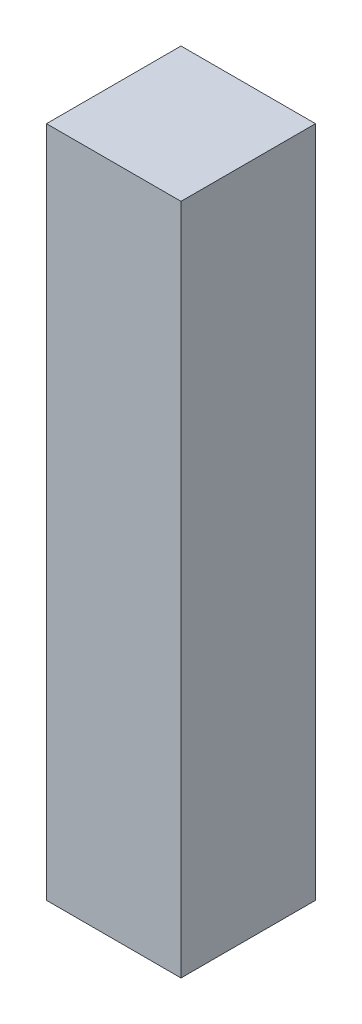
ISO-10303-21;
HEADER;
FILE_DESCRIPTION(('STEP AP214'),'2;1');
FILE_NAME('part.step','',(''),(''),'','','');
FILE_SCHEMA(('AUTOMOTIVE_DESIGN { 1 0 10303 214 1 1 1 1 }'));
ENDSEC;
DATA;
#1=APPLICATION_CONTEXT('core data for automotive mechanical design processes');
#2=APPLICATION_PROTOCOL_DEFINITION('international standard','automotive_design',2000,#1);
#3=PRODUCT_CONTEXT('',#1,'mechanical');
#4=PRODUCT('Part','Part','',(#3));
#5=PRODUCT_RELATED_PRODUCT_CATEGORY('part','',(#4));
#6=PRODUCT_DEFINITION_FORMATION('','',#4);
#7=PRODUCT_DEFINITION_CONTEXT('part definition',#1,'design');
#8=PRODUCT_DEFINITION('design','',#6,#7);
#9=PRODUCT_DEFINITION_SHAPE('','',#8);
#10=(LENGTH_UNIT() NAMED_UNIT(*) SI_UNIT(.MILLI.,.METRE.));
#11=(NAMED_UNIT(*) PLANE_ANGLE_UNIT() SI_UNIT($,.RADIAN.));
#12=(NAMED_UNIT(*) SI_UNIT($,.STERADIAN.) SOLID_ANGLE_UNIT());
#13=UNCERTAINTY_MEASURE_WITH_UNIT(LENGTH_MEASURE(1.E-05),#10,'distance_accuracy_value','');
#14=(GEOMETRIC_REPRESENTATION_CONTEXT(3) GLOBAL_UNCERTAINTY_ASSIGNED_CONTEXT((#13)) GLOBAL_UNIT_ASSIGNED_CONTEXT((#10,
#11,#12)) REPRESENTATION_CONTEXT('',''));
#15=CARTESIAN_POINT('',(0.,0.,0.));
#16=DIRECTION('',(0.,0.,1.));
#17=DIRECTION('',(1.,0.,0.));
#18=AXIS2_PLACEMENT_3D('',#15,#16,#17);
#19=CARTESIAN_POINT('',(0.5,5.,-0.5));
#20=DIRECTION('',(-1.,0.,0.));
#21=DIRECTION('',(0.,0.,1.));
#22=AXIS2_PLACEMENT_3D('',#19,#20,#21);
#23=PLANE('',#22);
#24=DIRECTION('',(0.,0.,-1.));
#25=VECTOR('',#24,1.);
#26=CARTESIAN_POINT('',(0.5,0.,-0.5));
#27=LINE('',#26,#25);
#28=CARTESIAN_POINT('',(0.5,0.,0.5));
#29=VERTEX_POINT('',#28);
#30=CARTESIAN_POINT('',(0.5,0.,-0.5));
#31=VERTEX_POINT('',#30);
#32=EDGE_CURVE('E113',#29,#31,#27,.T.);
#33=ORIENTED_EDGE('',*,*,#32,.T.);
#34=DIRECTION('',(0.,-1.,0.));
#35=VECTOR('',#34,1.);
#36=CARTESIAN_POINT('',(0.5,5.,-0.5));
#37=LINE('',#36,#35);
#38=CARTESIAN_POINT('',(0.5,5.,-0.5));
#39=VERTEX_POINT('',#38);
#40=EDGE_CURVE('E11',#39,#31,#37,.T.);
#41=ORIENTED_EDGE('',*,*,#40,.F.);
#42=DIRECTION('',(0.,0.,-1.));
#43=VECTOR('',#42,1.);
#44=CARTESIAN_POINT('',(0.5,5.,-0.5));
#45=LINE('',#44,#43);
#46=CARTESIAN_POINT('',(0.5,5.,0.5));
#47=VERTEX_POINT('',#46);
#48=EDGE_CURVE('E97',#47,#39,#45,.T.);
#49=ORIENTED_EDGE('',*,*,#48,.F.);
#50=DIRECTION('',(0.,-1.,0.));
#51=VECTOR('',#50,1.);
#52=CARTESIAN_POINT('',(0.5,5.,0.5));
#53=LINE('',#52,#51);
#54=EDGE_CURVE('E109',#47,#29,#53,.T.);
#55=ORIENTED_EDGE('',*,*,#54,.T.);
#56=EDGE_LOOP('',(#33,#41,#49,#55));
#57=FACE_BOUND('',#56,.T.);
#58=ADVANCED_FACE('F45',(#57),#23,.F.);
#59=CARTESIAN_POINT('',(-0.5,5.,-0.5));
#60=DIRECTION('',(0.,0.,1.));
#61=DIRECTION('',(1.,0.,0.));
#62=AXIS2_PLACEMENT_3D('',#59,#60,#61);
#63=PLANE('',#62);
#64=DIRECTION('',(-1.,0.,0.));
#65=VECTOR('',#64,1.);
#66=CARTESIAN_POINT('',(-0.5,0.,-0.5));
#67=LINE('',#66,#65);
#68=CARTESIAN_POINT('',(-0.5,0.,-0.5));
#69=VERTEX_POINT('',#68);
#70=EDGE_CURVE('E102',#31,#69,#67,.T.);
#71=ORIENTED_EDGE('',*,*,#70,.T.);
#72=DIRECTION('',(0.,-1.,0.));
#73=VECTOR('',#72,1.);
#74=CARTESIAN_POINT('',(-0.5,5.,-0.5));
#75=LINE('',#74,#73);
#76=CARTESIAN_POINT('',(-0.5,5.,-0.5));
#77=VERTEX_POINT('',#76);
#78=EDGE_CURVE('E54',#77,#69,#75,.T.);
#79=ORIENTED_EDGE('',*,*,#78,.F.);
#80=DIRECTION('',(-1.,0.,0.));
#81=VECTOR('',#80,1.);
#82=CARTESIAN_POINT('',(-0.5,5.,-0.5));
#83=LINE('',#82,#81);
#84=EDGE_CURVE('E92',#39,#77,#83,.T.);
#85=ORIENTED_EDGE('',*,*,#84,.F.);
#86=ORIENTED_EDGE('',*,*,#40,.T.);
#87=EDGE_LOOP('',(#71,#79,#85,#86));
#88=FACE_BOUND('',#87,.T.);
#89=ADVANCED_FACE('F101',(#88),#63,.F.);
#90=CARTESIAN_POINT('',(-0.5,5.,-0.5));
#91=DIRECTION('',(1.,0.,0.));
#92=DIRECTION('',(0.,0.,-1.));
#93=AXIS2_PLACEMENT_3D('',#90,#91,#92);
#94=PLANE('',#93);
#95=DIRECTION('',(0.,0.,1.));
#96=VECTOR('',#95,1.);
#97=CARTESIAN_POINT('',(-0.5,0.,-0.5));
#98=LINE('',#97,#96);
#99=CARTESIAN_POINT('',(-0.5,0.,0.5));
#100=VERTEX_POINT('',#99);
#101=EDGE_CURVE('E79',#69,#100,#98,.T.);
#102=ORIENTED_EDGE('',*,*,#101,.T.);
#103=DIRECTION('',(0.,-1.,0.));
#104=VECTOR('',#103,1.);
#105=CARTESIAN_POINT('',(-0.5,5.,0.5));
#106=LINE('',#105,#104);
#107=CARTESIAN_POINT('',(-0.5,5.,0.5));
#108=VERTEX_POINT('',#107);
#109=EDGE_CURVE('E104',#108,#100,#106,.T.);
#110=ORIENTED_EDGE('',*,*,#109,.F.);
#111=DIRECTION('',(0.,0.,1.));
#112=VECTOR('',#111,1.);
#113=CARTESIAN_POINT('',(-0.5,5.,-0.5));
#114=LINE('',#113,#112);
#115=EDGE_CURVE('E95',#77,#108,#114,.T.);
#116=ORIENTED_EDGE('',*,*,#115,.F.);
#117=ORIENTED_EDGE('',*,*,#78,.T.);
#118=EDGE_LOOP('',(#102,#110,#116,#117));
#119=FACE_BOUND('',#118,.T.);
#120=ADVANCED_FACE('F105',(#119),#94,.F.);
#121=CARTESIAN_POINT('',(-0.5,5.,0.5));
#122=DIRECTION('',(0.,0.,-1.));
#123=DIRECTION('',(-1.,0.,0.));
#124=AXIS2_PLACEMENT_3D('',#121,#122,#123);
#125=PLANE('',#124);
#126=DIRECTION('',(1.,0.,0.));
#127=VECTOR('',#126,1.);
#128=CARTESIAN_POINT('',(-0.5,0.,0.5));
#129=LINE('',#128,#127);
#130=EDGE_CURVE('E85',#100,#29,#129,.T.);
#131=ORIENTED_EDGE('',*,*,#130,.T.);
#132=ORIENTED_EDGE('',*,*,#54,.F.);
#133=DIRECTION('',(1.,0.,0.));
#134=VECTOR('',#133,1.);
#135=CARTESIAN_POINT('',(-0.5,5.,0.5));
#136=LINE('',#135,#134);
#137=EDGE_CURVE('E62',#108,#47,#136,.T.);
#138=ORIENTED_EDGE('',*,*,#137,.F.);
#139=ORIENTED_EDGE('',*,*,#109,.T.);
#140=EDGE_LOOP('',(#131,#132,#138,#139));
#141=FACE_BOUND('',#140,.T.);
#142=ADVANCED_FACE('F126',(#141),#125,.F.);
#143=CARTESIAN_POINT('',(0.,5.,0.));
#144=DIRECTION('',(0.,1.,0.));
#145=DIRECTION('',(0.,0.,1.));
#146=AXIS2_PLACEMENT_3D('',#143,#144,#145);
#147=PLANE('',#146);
#148=ORIENTED_EDGE('',*,*,#48,.T.);
#149=ORIENTED_EDGE('',*,*,#84,.T.);
#150=ORIENTED_EDGE('',*,*,#115,.T.);
#151=ORIENTED_EDGE('',*,*,#137,.T.);
#152=EDGE_LOOP('',(#148,#149,#150,#151));
#153=FACE_BOUND('',#152,.T.);
#154=ADVANCED_FACE('F93',(#153),#147,.T.);
#155=CARTESIAN_POINT('',(0.,0.,0.));
#156=DIRECTION('',(0.,1.,0.));
#157=DIRECTION('',(0.,0.,1.));
#158=AXIS2_PLACEMENT_3D('',#155,#156,#157);
#159=PLANE('',#158);
#160=ORIENTED_EDGE('',*,*,#32,.F.);
#161=ORIENTED_EDGE('',*,*,#130,.F.);
#162=ORIENTED_EDGE('',*,*,#101,.F.);
#163=ORIENTED_EDGE('',*,*,#70,.F.);
#164=EDGE_LOOP('',(#160,#161,#162,#163));
#165=FACE_BOUND('',#164,.T.);
#166=ADVANCED_FACE('F129',(#165),#159,.F.);
#167=CLOSED_SHELL('',(#58,#89,#120,#142,#154,#166));
#168=MANIFOLD_SOLID_BREP('B2',#167);
#169=ADVANCED_BREP_SHAPE_REPRESENTATION('',(#18,#168),#14);
#170=SHAPE_DEFINITION_REPRESENTATION(#9,#169);
ENDSEC;
END-ISO-10303-21;
